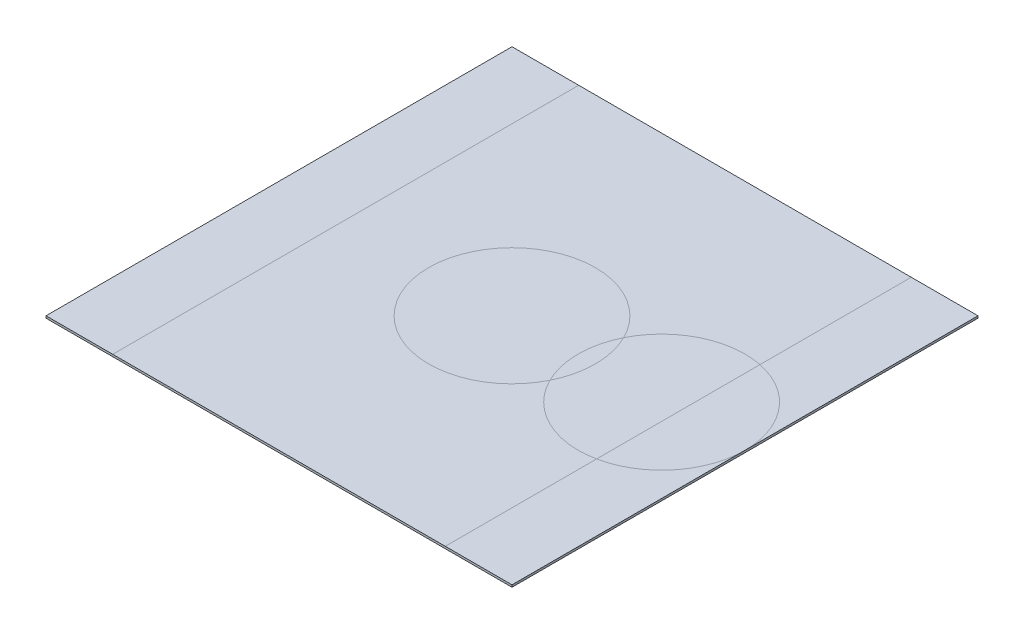
ISO-10303-21;
HEADER;
FILE_DESCRIPTION(('STEP AP214'),'2;1');
FILE_NAME('part.step','',(''),(''),'','','');
FILE_SCHEMA(('AUTOMOTIVE_DESIGN { 1 0 10303 214 1 1 1 1 }'));
ENDSEC;
DATA;
#1=APPLICATION_CONTEXT('core data for automotive mechanical design processes');
#2=APPLICATION_PROTOCOL_DEFINITION('international standard','automotive_design',2000,#1);
#3=PRODUCT_CONTEXT('',#1,'mechanical');
#4=PRODUCT('Part','Part','',(#3));
#5=PRODUCT_RELATED_PRODUCT_CATEGORY('part','',(#4));
#6=PRODUCT_DEFINITION_FORMATION('','',#4);
#7=PRODUCT_DEFINITION_CONTEXT('part definition',#1,'design');
#8=PRODUCT_DEFINITION('design','',#6,#7);
#9=PRODUCT_DEFINITION_SHAPE('','',#8);
#10=(LENGTH_UNIT() NAMED_UNIT(*) SI_UNIT(.MILLI.,.METRE.));
#11=(NAMED_UNIT(*) PLANE_ANGLE_UNIT() SI_UNIT($,.RADIAN.));
#12=(NAMED_UNIT(*) SI_UNIT($,.STERADIAN.) SOLID_ANGLE_UNIT());
#13=UNCERTAINTY_MEASURE_WITH_UNIT(LENGTH_MEASURE(1.E-05),#10,'distance_accuracy_value','');
#14=(GEOMETRIC_REPRESENTATION_CONTEXT(3) GLOBAL_UNCERTAINTY_ASSIGNED_CONTEXT((#13)) GLOBAL_UNIT_ASSIGNED_CONTEXT((#10,
#11,#12)) REPRESENTATION_CONTEXT('',''));
#15=CARTESIAN_POINT('',(0.,0.,0.));
#16=DIRECTION('',(0.,0.,1.));
#17=DIRECTION('',(1.,0.,0.));
#18=AXIS2_PLACEMENT_3D('',#15,#16,#17);
#19=CARTESIAN_POINT('',(0.,0.3175,0.));
#20=DIRECTION('',(0.,-1.,0.));
#21=DIRECTION('',(0.,0.,-1.));
#22=AXIS2_PLACEMENT_3D('',#19,#20,#21);
#23=PLANE('',#22);
#24=DIRECTION('',(0.,0.,1.));
#25=VECTOR('',#24,1.);
#26=CARTESIAN_POINT('',(49.85,0.3175,0.));
#27=LINE('',#26,#25);
#28=CARTESIAN_POINT('',(49.85,0.3175,-69.85));
#29=VERTEX_POINT('',#28);
#30=CARTESIAN_POINT('',(49.85,0.3175,-24.4948974278318));
#31=VERTEX_POINT('',#30);
#32=EDGE_CURVE('E11',#29,#31,#27,.T.);
#33=ORIENTED_EDGE('',*,*,#32,.F.);
#34=DIRECTION('',(-1.,0.,0.));
#35=VECTOR('',#34,1.);
#36=CARTESIAN_POINT('',(-69.85,0.3175,-69.85));
#37=LINE('',#36,#35);
#38=CARTESIAN_POINT('',(-49.85,0.3175,-69.85));
#39=VERTEX_POINT('',#38);
#40=EDGE_CURVE('E124',#29,#39,#37,.T.);
#41=ORIENTED_EDGE('',*,*,#40,.T.);
#42=DIRECTION('',(0.,0.,-1.));
#43=VECTOR('',#42,1.);
#44=CARTESIAN_POINT('',(-49.85,0.3175,0.));
#45=LINE('',#44,#43);
#46=CARTESIAN_POINT('',(-49.85,0.3175,69.85));
#47=VERTEX_POINT('',#46);
#48=EDGE_CURVE('E150',#47,#39,#45,.T.);
#49=ORIENTED_EDGE('',*,*,#48,.F.);
#50=DIRECTION('',(1.,0.,0.));
#51=VECTOR('',#50,1.);
#52=CARTESIAN_POINT('',(-69.85,0.3175,69.85));
#53=LINE('',#52,#51);
#54=CARTESIAN_POINT('',(49.85,0.3175,69.85));
#55=VERTEX_POINT('',#54);
#56=EDGE_CURVE('E337',#47,#55,#53,.T.);
#57=ORIENTED_EDGE('',*,*,#56,.T.);
#58=CARTESIAN_POINT('',(49.85,0.3175,24.4948974278318));
#59=VERTEX_POINT('',#58);
#60=EDGE_CURVE('E47',#59,#55,#27,.T.);
#61=ORIENTED_EDGE('',*,*,#60,.F.);
#62=CARTESIAN_POINT('',(44.85,0.3175,0.));
#63=DIRECTION('',(0.,-1.,0.));
#64=DIRECTION('',(0.,0.,-1.));
#65=AXIS2_PLACEMENT_3D('',#62,#63,#64);
#66=CIRCLE('',#65,25.);
#67=CARTESIAN_POINT('',(22.425,0.3175,11.0507635482803));
#68=VERTEX_POINT('',#67);
#69=EDGE_CURVE('E146',#68,#59,#66,.F.);
#70=ORIENTED_EDGE('',*,*,#69,.F.);
#71=CARTESIAN_POINT('',(0.,0.3175,0.));
#72=DIRECTION('',(0.,-1.,0.));
#73=DIRECTION('',(0.,0.,-1.));
#74=AXIS2_PLACEMENT_3D('',#71,#72,#73);
#75=CIRCLE('',#74,25.);
#76=CARTESIAN_POINT('',(22.425,0.3175,-11.0507635482803));
#77=VERTEX_POINT('',#76);
#78=EDGE_CURVE('E131',#77,#68,#75,.F.);
#79=ORIENTED_EDGE('',*,*,#78,.F.);
#80=EDGE_CURVE('E152',#31,#77,#66,.F.);
#81=ORIENTED_EDGE('',*,*,#80,.F.);
#82=EDGE_LOOP('',(#33,#41,#49,#57,#61,#70,#79,#81));
#83=FACE_BOUND('',#82,.T.);
#84=ADVANCED_FACE('F37',(#83),#23,.F.);
#85=CARTESIAN_POINT('',(69.85,0.3175,-69.85));
#86=VERTEX_POINT('',#85);
#87=EDGE_CURVE('E108',#86,#29,#37,.T.);
#88=ORIENTED_EDGE('',*,*,#87,.T.);
#89=ORIENTED_EDGE('',*,*,#32,.T.);
#90=CARTESIAN_POINT('',(69.85,0.3175,0.));
#91=VERTEX_POINT('',#90);
#92=EDGE_CURVE('E110',#91,#31,#66,.F.);
#93=ORIENTED_EDGE('',*,*,#92,.F.);
#94=DIRECTION('',(0.,0.,-1.));
#95=VECTOR('',#94,1.);
#96=CARTESIAN_POINT('',(69.85,0.3175,69.85));
#97=LINE('',#96,#95);
#98=EDGE_CURVE('E105',#91,#86,#97,.T.);
#99=ORIENTED_EDGE('',*,*,#98,.T.);
#100=EDGE_LOOP('',(#88,#89,#93,#99));
#101=FACE_BOUND('',#100,.T.);
#102=ADVANCED_FACE('F107',(#101),#23,.F.);
#103=DIRECTION('',(0.,0.,1.));
#104=VECTOR('',#103,1.);
#105=CARTESIAN_POINT('',(49.85,0.3175,0.));
#106=LINE('',#105,#104);
#107=EDGE_CURVE('E41',#31,#59,#106,.T.);
#108=ORIENTED_EDGE('',*,*,#107,.F.);
#109=ORIENTED_EDGE('',*,*,#80,.T.);
#110=EDGE_CURVE('E136',#68,#77,#75,.F.);
#111=ORIENTED_EDGE('',*,*,#110,.F.);
#112=ORIENTED_EDGE('',*,*,#69,.T.);
#113=EDGE_LOOP('',(#108,#109,#111,#112));
#114=FACE_BOUND('',#113,.T.);
#115=ADVANCED_FACE('F187',(#114),#23,.F.);
#116=EDGE_CURVE('E151',#59,#91,#66,.F.);
#117=ORIENTED_EDGE('',*,*,#116,.F.);
#118=ORIENTED_EDGE('',*,*,#60,.T.);
#119=CARTESIAN_POINT('',(69.85,0.3175,69.85));
#120=VERTEX_POINT('',#119);
#121=EDGE_CURVE('E336',#55,#120,#53,.T.);
#122=ORIENTED_EDGE('',*,*,#121,.T.);
#123=EDGE_CURVE('E115',#120,#91,#97,.T.);
#124=ORIENTED_EDGE('',*,*,#123,.T.);
#125=EDGE_LOOP('',(#117,#118,#122,#124));
#126=FACE_BOUND('',#125,.T.);
#127=ADVANCED_FACE('F186',(#126),#23,.F.);
#128=CARTESIAN_POINT('',(-69.85,0.3175,69.85));
#129=VERTEX_POINT('',#128);
#130=EDGE_CURVE('E326',#129,#47,#53,.T.);
#131=ORIENTED_EDGE('',*,*,#130,.T.);
#132=ORIENTED_EDGE('',*,*,#48,.T.);
#133=CARTESIAN_POINT('',(-69.85,0.3175,-69.85));
#134=VERTEX_POINT('',#133);
#135=EDGE_CURVE('E127',#39,#134,#37,.T.);
#136=ORIENTED_EDGE('',*,*,#135,.T.);
#137=DIRECTION('',(0.,0.,1.));
#138=VECTOR('',#137,1.);
#139=CARTESIAN_POINT('',(-69.85,0.3175,69.85));
#140=LINE('',#139,#138);
#141=EDGE_CURVE('E125',#134,#129,#140,.T.);
#142=ORIENTED_EDGE('',*,*,#141,.T.);
#143=EDGE_LOOP('',(#131,#132,#136,#142));
#144=FACE_BOUND('',#143,.T.);
#145=ADVANCED_FACE('F195',(#144),#23,.F.);
#146=CARTESIAN_POINT('',(44.85,0.3175,0.));
#147=DIRECTION('',(0.,-1.,0.));
#148=DIRECTION('',(0.,0.,-1.));
#149=AXIS2_PLACEMENT_3D('',#146,#147,#148);
#150=CIRCLE('',#149,25.);
#151=EDGE_CURVE('E145',#77,#68,#150,.F.);
#152=ORIENTED_EDGE('',*,*,#151,.F.);
#153=ORIENTED_EDGE('',*,*,#78,.T.);
#154=EDGE_LOOP('',(#152,#153));
#155=FACE_BOUND('',#154,.T.);
#156=ADVANCED_FACE('F193',(#155),#23,.F.);
#157=ORIENTED_EDGE('',*,*,#92,.T.);
#158=ORIENTED_EDGE('',*,*,#107,.T.);
#159=ORIENTED_EDGE('',*,*,#116,.T.);
#160=EDGE_LOOP('',(#157,#158,#159));
#161=FACE_BOUND('',#160,.T.);
#162=ADVANCED_FACE('F185',(#161),#23,.F.);
#163=CARTESIAN_POINT('',(69.85,0.3175,69.85));
#164=DIRECTION('',(-1.,0.,0.));
#165=DIRECTION('',(0.,0.,1.));
#166=AXIS2_PLACEMENT_3D('',#163,#164,#165);
#167=PLANE('',#166);
#168=DIRECTION('',(0.,0.,-1.));
#169=VECTOR('',#168,1.);
#170=CARTESIAN_POINT('',(69.85,-0.3175,69.85));
#171=LINE('',#170,#169);
#172=CARTESIAN_POINT('',(69.85,-0.3175,69.85));
#173=VERTEX_POINT('',#172);
#174=CARTESIAN_POINT('',(69.85,-0.3175,-69.85));
#175=VERTEX_POINT('',#174);
#176=EDGE_CURVE('E130',#173,#175,#171,.T.);
#177=ORIENTED_EDGE('',*,*,#176,.T.);
#178=DIRECTION('',(0.,-1.,0.));
#179=VECTOR('',#178,1.);
#180=CARTESIAN_POINT('',(69.85,0.3175,-69.85));
#181=LINE('',#180,#179);
#182=EDGE_CURVE('E121',#86,#175,#181,.T.);
#183=ORIENTED_EDGE('',*,*,#182,.F.);
#184=ORIENTED_EDGE('',*,*,#98,.F.);
#185=ORIENTED_EDGE('',*,*,#123,.F.);
#186=DIRECTION('',(0.,-1.,0.));
#187=VECTOR('',#186,1.);
#188=CARTESIAN_POINT('',(69.85,0.3175,69.85));
#189=LINE('',#188,#187);
#190=EDGE_CURVE('E320',#120,#173,#189,.T.);
#191=ORIENTED_EDGE('',*,*,#190,.T.);
#192=EDGE_LOOP('',(#177,#183,#184,#185,#191));
#193=FACE_BOUND('',#192,.T.);
#194=ADVANCED_FACE('F39',(#193),#167,.F.);
#195=CARTESIAN_POINT('',(-69.85,0.3175,-69.85));
#196=DIRECTION('',(0.,0.,1.));
#197=DIRECTION('',(1.,0.,0.));
#198=AXIS2_PLACEMENT_3D('',#195,#196,#197);
#199=PLANE('',#198);
#200=DIRECTION('',(-1.,0.,0.));
#201=VECTOR('',#200,1.);
#202=CARTESIAN_POINT('',(-69.85,-0.3175,-69.85));
#203=LINE('',#202,#201);
#204=CARTESIAN_POINT('',(-69.85,-0.3175,-69.85));
#205=VERTEX_POINT('',#204);
#206=EDGE_CURVE('E328',#175,#205,#203,.T.);
#207=ORIENTED_EDGE('',*,*,#206,.T.);
#208=DIRECTION('',(0.,-1.,0.));
#209=VECTOR('',#208,1.);
#210=CARTESIAN_POINT('',(-69.85,0.3175,-69.85));
#211=LINE('',#210,#209);
#212=EDGE_CURVE('E132',#134,#205,#211,.T.);
#213=ORIENTED_EDGE('',*,*,#212,.F.);
#214=ORIENTED_EDGE('',*,*,#135,.F.);
#215=ORIENTED_EDGE('',*,*,#40,.F.);
#216=ORIENTED_EDGE('',*,*,#87,.F.);
#217=ORIENTED_EDGE('',*,*,#182,.T.);
#218=EDGE_LOOP('',(#207,#213,#214,#215,#216,#217));
#219=FACE_BOUND('',#218,.T.);
#220=ADVANCED_FACE('F120',(#219),#199,.F.);
#221=CARTESIAN_POINT('',(-69.85,0.3175,69.85));
#222=DIRECTION('',(1.,0.,0.));
#223=DIRECTION('',(0.,0.,-1.));
#224=AXIS2_PLACEMENT_3D('',#221,#222,#223);
#225=PLANE('',#224);
#226=DIRECTION('',(0.,0.,1.));
#227=VECTOR('',#226,1.);
#228=CARTESIAN_POINT('',(-69.85,-0.3175,69.85));
#229=LINE('',#228,#227);
#230=CARTESIAN_POINT('',(-69.85,-0.3175,69.85));
#231=VERTEX_POINT('',#230);
#232=EDGE_CURVE('E324',#205,#231,#229,.T.);
#233=ORIENTED_EDGE('',*,*,#232,.T.);
#234=DIRECTION('',(0.,-1.,0.));
#235=VECTOR('',#234,1.);
#236=CARTESIAN_POINT('',(-69.85,0.3175,69.85));
#237=LINE('',#236,#235);
#238=EDGE_CURVE('E139',#129,#231,#237,.T.);
#239=ORIENTED_EDGE('',*,*,#238,.F.);
#240=ORIENTED_EDGE('',*,*,#141,.F.);
#241=ORIENTED_EDGE('',*,*,#212,.T.);
#242=EDGE_LOOP('',(#233,#239,#240,#241));
#243=FACE_BOUND('',#242,.T.);
#244=ADVANCED_FACE('F214',(#243),#225,.F.);
#245=CARTESIAN_POINT('',(-69.85,0.3175,69.85));
#246=DIRECTION('',(0.,0.,-1.));
#247=DIRECTION('',(-1.,0.,0.));
#248=AXIS2_PLACEMENT_3D('',#245,#246,#247);
#249=PLANE('',#248);
#250=DIRECTION('',(1.,0.,0.));
#251=VECTOR('',#250,1.);
#252=CARTESIAN_POINT('',(-69.85,-0.3175,69.85));
#253=LINE('',#252,#251);
#254=EDGE_CURVE('E116',#231,#173,#253,.T.);
#255=ORIENTED_EDGE('',*,*,#254,.T.);
#256=ORIENTED_EDGE('',*,*,#190,.F.);
#257=ORIENTED_EDGE('',*,*,#121,.F.);
#258=ORIENTED_EDGE('',*,*,#56,.F.);
#259=ORIENTED_EDGE('',*,*,#130,.F.);
#260=ORIENTED_EDGE('',*,*,#238,.T.);
#261=EDGE_LOOP('',(#255,#256,#257,#258,#259,#260));
#262=FACE_BOUND('',#261,.T.);
#263=ADVANCED_FACE('F208',(#262),#249,.F.);
#264=ORIENTED_EDGE('',*,*,#110,.T.);
#265=ORIENTED_EDGE('',*,*,#151,.T.);
#266=EDGE_LOOP('',(#264,#265));
#267=FACE_BOUND('',#266,.T.);
#268=ADVANCED_FACE('F191',(#267),#23,.F.);
#269=CARTESIAN_POINT('',(0.,-0.3175,0.));
#270=DIRECTION('',(0.,-1.,0.));
#271=DIRECTION('',(0.,0.,-1.));
#272=AXIS2_PLACEMENT_3D('',#269,#270,#271);
#273=PLANE('',#272);
#274=ORIENTED_EDGE('',*,*,#176,.F.);
#275=ORIENTED_EDGE('',*,*,#254,.F.);
#276=ORIENTED_EDGE('',*,*,#232,.F.);
#277=ORIENTED_EDGE('',*,*,#206,.F.);
#278=EDGE_LOOP('',(#274,#275,#276,#277));
#279=FACE_BOUND('',#278,.T.);
#280=ADVANCED_FACE('F207',(#279),#273,.T.);
#281=CLOSED_SHELL('',(#84,#102,#115,#127,#145,#156,#162,#194,#220,#244,#263,#268,#280));
#282=MANIFOLD_SOLID_BREP('B2',#281);
#283=ADVANCED_BREP_SHAPE_REPRESENTATION('',(#18,#282),#14);
#284=SHAPE_DEFINITION_REPRESENTATION(#9,#283);
ENDSEC;
END-ISO-10303-21;
